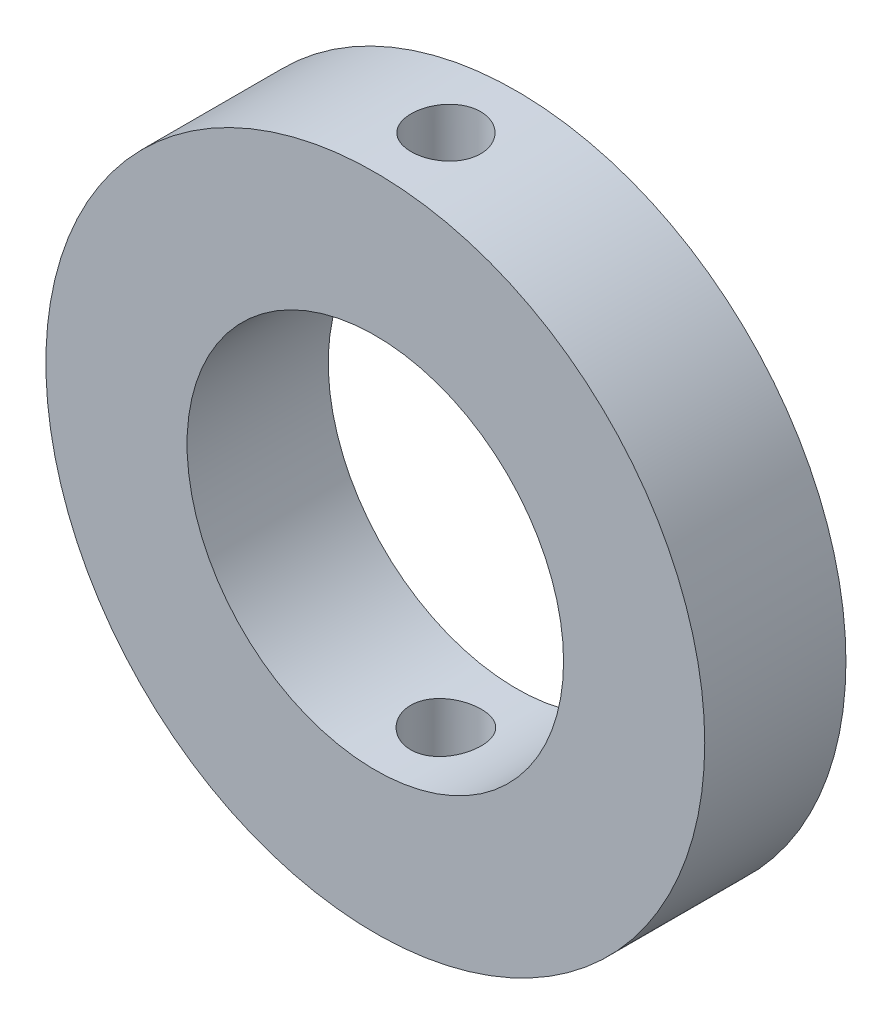
ISO-10303-21;
HEADER;
FILE_DESCRIPTION(('STEP AP214'),'2;1');
FILE_NAME('part.step','',(''),(''),'','','');
FILE_SCHEMA(('AUTOMOTIVE_DESIGN { 1 0 10303 214 1 1 1 1 }'));
ENDSEC;
DATA;
#1=APPLICATION_CONTEXT('core data for automotive mechanical design processes');
#2=APPLICATION_PROTOCOL_DEFINITION('international standard','automotive_design',2000,#1);
#3=PRODUCT_CONTEXT('',#1,'mechanical');
#4=PRODUCT('Part','Part','',(#3));
#5=PRODUCT_RELATED_PRODUCT_CATEGORY('part','',(#4));
#6=PRODUCT_DEFINITION_FORMATION('','',#4);
#7=PRODUCT_DEFINITION_CONTEXT('part definition',#1,'design');
#8=PRODUCT_DEFINITION('design','',#6,#7);
#9=PRODUCT_DEFINITION_SHAPE('','',#8);
#10=(LENGTH_UNIT() NAMED_UNIT(*) SI_UNIT(.MILLI.,.METRE.));
#11=(NAMED_UNIT(*) PLANE_ANGLE_UNIT() SI_UNIT($,.RADIAN.));
#12=(NAMED_UNIT(*) SI_UNIT($,.STERADIAN.) SOLID_ANGLE_UNIT());
#13=UNCERTAINTY_MEASURE_WITH_UNIT(LENGTH_MEASURE(1.E-05),#10,'distance_accuracy_value','');
#14=(GEOMETRIC_REPRESENTATION_CONTEXT(3) GLOBAL_UNCERTAINTY_ASSIGNED_CONTEXT((#13)) GLOBAL_UNIT_ASSIGNED_CONTEXT((#10,
#11,#12)) REPRESENTATION_CONTEXT('',''));
#15=CARTESIAN_POINT('',(0.,0.,0.));
#16=DIRECTION('',(0.,0.,1.));
#17=DIRECTION('',(1.,0.,0.));
#18=AXIS2_PLACEMENT_3D('',#15,#16,#17);
#19=CARTESIAN_POINT('',(0.,0.,4.7625));
#20=DIRECTION('',(0.,0.,-1.));
#21=DIRECTION('',(-1.,0.,0.));
#22=AXIS2_PLACEMENT_3D('',#19,#20,#21);
#23=CYLINDRICAL_SURFACE('',#22,11.1125);
#24=CARTESIAN_POINT('',(-0.841698326425389,11.0805776102734,1.5657979969277));
#25=CARTESIAN_POINT('',(-0.887456960862435,11.077101739902,1.61302840428348));
#26=CARTESIAN_POINT('',(-0.929261940955323,11.0736406475918,1.6641500561508));
#27=CARTESIAN_POINT('',(-1.0037461861398,11.0671385758728,1.77273865475646));
#28=CARTESIAN_POINT('',(-1.03641561509168,11.0640980510498,1.83021234851041));
#29=CARTESIAN_POINT('',(-1.09165020440123,11.058785144105,1.94985001516101));
#30=CARTESIAN_POINT('',(-1.11421771090546,11.0565125836555,2.01201289508271));
#31=CARTESIAN_POINT('',(-1.14859192084496,11.0529948186015,2.13925735469615));
#32=CARTESIAN_POINT('',(-1.16040132336789,11.051749356317,2.20433819800199));
#33=CARTESIAN_POINT('',(-1.17289918521659,11.050430032407,2.33533526115212));
#34=CARTESIAN_POINT('',(-1.17362736846984,11.0503519858497,2.40124764889747));
#35=CARTESIAN_POINT('',(-1.16404292357263,11.0513656536687,2.53225702649961));
#36=CARTESIAN_POINT('',(-1.15373002585106,11.0524573966059,2.59735399640847));
#37=CARTESIAN_POINT('',(-1.12239930934797,11.055682739142,2.7247447710209));
#38=CARTESIAN_POINT('',(-1.10140398219269,11.0578141493558,2.78704416724645));
#39=CARTESIAN_POINT('',(-1.04932600379547,11.0628771945404,2.90723822607505));
#40=CARTESIAN_POINT('',(-1.01824310482055,11.0658088491634,2.96513278045983));
#41=CARTESIAN_POINT('',(-0.946726950676453,11.0721566775975,3.07512751012811));
#42=CARTESIAN_POINT('',(-0.906256768914601,11.0755747437183,3.12720356611674));
#43=CARTESIAN_POINT('',(-0.817172201188247,11.0825031870893,3.22384258620289));
#44=CARTESIAN_POINT('',(-0.768557614954379,11.0860135666077,3.26840536549629));
#45=CARTESIAN_POINT('',(-0.664337517764288,11.0927473667703,3.34892696081736));
#46=CARTESIAN_POINT('',(-0.608705669421817,11.0959696238055,3.38485179774944));
#47=CARTESIAN_POINT('',(-0.49216621831279,11.1017488645506,3.44684742627995));
#48=CARTESIAN_POINT('',(-0.431258693337211,11.1043058580677,3.47291836314585));
#49=CARTESIAN_POINT('',(-0.306033994338718,11.108461293405,3.5144040529963));
#50=CARTESIAN_POINT('',(-0.24172464089294,11.1100618379876,3.52984219378192));
#51=CARTESIAN_POINT('',(-0.111409668123426,11.1121324992083,3.54970078348677));
#52=CARTESIAN_POINT('',(-0.0454041046493234,11.1126026530176,3.55412159469562));
#53=CARTESIAN_POINT('',(0.0860951748870768,11.1123600990054,3.55182109180445));
#54=CARTESIAN_POINT('',(0.151589832745728,11.1116530015016,3.5451526250296));
#55=CARTESIAN_POINT('',(0.280522850293855,11.1091458956894,3.52096996403273));
#56=CARTESIAN_POINT('',(0.343961207200995,11.1073458859023,3.50345575513622));
#57=CARTESIAN_POINT('',(0.466998873972595,11.1028537698324,3.45808740054108));
#58=CARTESIAN_POINT('',(0.526597739738218,11.1001615605729,3.4302320612355));
#59=CARTESIAN_POINT('',(0.640285749354609,11.0941847448392,3.36497616748501));
#60=CARTESIAN_POINT('',(0.694374715047201,11.0909001192193,3.32757530453027));
#61=CARTESIAN_POINT('',(0.795785263635065,11.0840868783762,3.24407698746112));
#62=CARTESIAN_POINT('',(0.84307310114645,11.0805571672219,3.19793863341919));
#63=CARTESIAN_POINT('',(0.929246111684692,11.0736638665026,3.09837641549377));
#64=CARTESIAN_POINT('',(0.96813116460663,11.0703002793126,3.04495244749139));
#65=CARTESIAN_POINT('',(1.03646820770654,11.0641119871222,2.9321982405629));
#66=CARTESIAN_POINT('',(1.06590082949595,11.0612883933145,2.87285619704791));
#67=CARTESIAN_POINT('',(1.11437335936579,11.0565105357714,2.75003652671121));
#68=CARTESIAN_POINT('',(1.13341356456308,11.054556247183,2.68655901817959));
#69=CARTESIAN_POINT('',(1.16048842612473,11.0517468956613,2.55754005969101));
#70=CARTESIAN_POINT('',(1.1685667582149,11.0508874712698,2.49200787122982));
#71=CARTESIAN_POINT('',(1.17362099415319,11.0503518953607,2.36051280041465));
#72=CARTESIAN_POINT('',(1.17059718069523,11.0506757137142,2.29454992906985));
#73=CARTESIAN_POINT('',(1.15357049867794,11.0524659094168,2.16433334282902));
#74=CARTESIAN_POINT('',(1.13961000267373,11.053927877039,2.10007401904406));
#75=CARTESIAN_POINT('',(1.1011688323638,11.057823189277,1.97481478942584));
#76=CARTESIAN_POINT('',(1.07668800123347,11.0602565483731,1.91381493219607));
#77=CARTESIAN_POINT('',(1.01784017695398,11.0658270792393,1.79664662568117));
#78=CARTESIAN_POINT('',(0.983450602601565,11.0689658549597,1.74048959695828));
#79=CARTESIAN_POINT('',(0.905779757471185,11.0755917981051,1.63472636625763));
#80=CARTESIAN_POINT('',(0.862498181763728,11.0790789774757,1.58512038902805));
#81=CARTESIAN_POINT('',(0.768020660274708,11.0860294884988,1.4936152484213));
#82=CARTESIAN_POINT('',(0.716787178653716,11.0894926211585,1.45175481489174));
#83=CARTESIAN_POINT('',(0.607997580829135,11.0959884496379,1.37722356570963));
#84=CARTESIAN_POINT('',(0.550441459450646,11.0990211451052,1.3445527575786));
#85=CARTESIAN_POINT('',(0.43063057132255,11.1043147004596,1.28933825323775));
#86=CARTESIAN_POINT('',(0.368376093391156,11.1065756077431,1.26679393512183));
#87=CARTESIAN_POINT('',(0.240938749902661,11.1100704132671,1.23248868977641));
#88=CARTESIAN_POINT('',(0.175756083785713,11.1113043813415,1.22072702930007));
#89=CARTESIAN_POINT('',(0.0446527392762468,11.1126026797177,1.20836255039739));
#90=CARTESIAN_POINT('',(-0.0212627568079269,11.1126727124683,1.20770532792226));
#91=CARTESIAN_POINT('',(-0.152279988979814,11.1116497274985,1.2174318106195));
#92=CARTESIAN_POINT('',(-0.217381553520133,11.1105564686439,1.2278178048977));
#93=CARTESIAN_POINT('',(-0.344797564320643,11.1073322617539,1.25929950087441));
#94=CARTESIAN_POINT('',(-0.40711625438565,11.1052029570765,1.28037824416492));
#95=CARTESIAN_POINT('',(-0.527284040473263,11.1001459728163,1.33261822706607));
#96=CARTESIAN_POINT('',(-0.585137722981045,11.0972191268659,1.36376894522221));
#97=CARTESIAN_POINT('',(-0.676548872191015,11.0919470744632,1.42334276915089));
#98=CARTESIAN_POINT('',(-0.71179225042346,11.0897317163237,1.44923335053269));
#99=CARTESIAN_POINT('',(-0.779171220760057,11.0852012695936,1.50477643518594));
#100=CARTESIAN_POINT('',(-0.811306796165637,11.0828861804672,1.53442895866874));
#101=CARTESIAN_POINT('',(-0.841698326425389,11.0805776102734,1.5657979969277));
#102=B_SPLINE_CURVE_WITH_KNOTS('',3,(#24,#25,#26,#27,#28,#29,#30,#31,#32,#33,#34,#35,#36,#37,
#38,#39,#40,#41,#42,#43,#44,#45,#46,#47,#48,#49,#50,#51,#52,#53,#54,#55,#56,#57,#58,#59,#60,#61,
#62,#63,#64,#65,#66,#67,#68,#69,#70,#71,#72,#73,#74,#75,#76,#77,#78,#79,#80,#81,#82,#83,#84,#85,
#86,#87,#88,#89,#90,#91,#92,#93,#94,#95,#96,#97,#98,#99,#100,#101),.UNSPECIFIED.,.T.,.F.,(4,2,2,
2,2,2,2,2,2,2,2,2,2,2,2,2,2,2,2,2,2,2,2,2,2,2,2,2,2,2,2,2,2,2,2,2,2,2,4),(0.,0.197401308403678,
0.39501434521769,0.592581463048866,0.790098999842977,0.986908308782151,1.18372242298558,
1.38012385357512,1.57653010780246,1.77372247245705,1.9709196867465,2.16888037036877,
2.36683813551527,2.56435907189634,2.76187351298902,2.9584493694745,3.15502549193143,
3.35162431090263,3.54822948472172,3.74577878796956,3.94333091469497,4.14128528809065,
4.33923400171875,4.53639168334324,4.73354434477661,4.92993692247875,5.12633242786902,
5.32317909101162,5.52003250565736,5.71784510512392,5.91565786649566,6.11345847777508,
6.31124563713592,6.50806349398541,6.70492215640452,6.90146957794564,7.09781234057103,
7.22891974092027,7.36002784568504),.UNSPECIFIED.);
#103=CARTESIAN_POINT('',(-0.841698326425389,11.0805776102734,1.5657979969277));
#104=VERTEX_POINT('',#103);
#105=EDGE_CURVE('E72',#104,#104,#102,.T.);
#106=ORIENTED_EDGE('',*,*,#105,.F.);
#107=EDGE_LOOP('',(#106));
#108=FACE_BOUND('',#107,.T.);
#109=CARTESIAN_POINT('',(0.,0.,4.7625));
#110=DIRECTION('',(0.,0.,1.));
#111=DIRECTION('',(1.,0.,0.));
#112=AXIS2_PLACEMENT_3D('',#109,#110,#111);
#113=CIRCLE('',#112,11.1125);
#114=CARTESIAN_POINT('',(11.1125,0.,4.7625));
#115=VERTEX_POINT('',#114);
#116=EDGE_CURVE('E10',#115,#115,#113,.T.);
#117=ORIENTED_EDGE('',*,*,#116,.F.);
#118=EDGE_LOOP('',(#117));
#119=FACE_BOUND('',#118,.T.);
#120=CARTESIAN_POINT('',(0.,0.,0.));
#121=DIRECTION('',(0.,0.,1.));
#122=DIRECTION('',(1.,0.,0.));
#123=AXIS2_PLACEMENT_3D('',#120,#121,#122);
#124=CIRCLE('',#123,11.1125);
#125=CARTESIAN_POINT('',(11.1125,0.,0.));
#126=VERTEX_POINT('',#125);
#127=EDGE_CURVE('E45',#126,#126,#124,.T.);
#128=ORIENTED_EDGE('',*,*,#127,.T.);
#129=EDGE_LOOP('',(#128));
#130=FACE_BOUND('',#129,.T.);
#131=CARTESIAN_POINT('',(-0.856986535747215,-11.0794056847625,1.55039458604627));
#132=CARTESIAN_POINT('',(-0.810348575017801,-11.0830128075068,1.50228867742869));
#133=CARTESIAN_POINT('',(-0.759621719416622,-11.0866392771216,1.45808757289963));
#134=CARTESIAN_POINT('',(-0.651415629052091,-11.0935229993324,1.37878006401395));
#135=CARTESIAN_POINT('',(-0.593929191523836,-11.0967798506829,1.34368349110681));
#136=CARTESIAN_POINT('',(-0.473857535539345,-11.1025547453848,1.28363325646928));
#137=CARTESIAN_POINT('',(-0.411273527584085,-11.1050729634869,1.25867719509046));
#138=CARTESIAN_POINT('',(-0.282788123772219,-11.1090870122136,1.21963285012448));
#139=CARTESIAN_POINT('',(-0.216887568692315,-11.1105831005702,1.2055418267822));
#140=CARTESIAN_POINT('',(-0.0838798350980418,-11.1123816889319,1.18866226310655));
#141=CARTESIAN_POINT('',(-0.0167778633549996,-11.1126884726953,1.18583315746159));
#142=CARTESIAN_POINT('',(0.11694844993892,-11.1120857860822,1.19144970307967));
#143=CARTESIAN_POINT('',(0.183572781796129,-11.1111762910914,1.19989558252017));
#144=CARTESIAN_POINT('',(0.314265793165964,-11.108247233622,1.22777536210551));
#145=CARTESIAN_POINT('',(0.378340879867034,-11.1062306712083,1.24717957010991));
#146=CARTESIAN_POINT('',(0.502325640094421,-11.1013142512173,1.29639256272892));
#147=CARTESIAN_POINT('',(0.56223522145322,-11.0984143741031,1.32620157747635));
#148=CARTESIAN_POINT('',(0.676430688067251,-11.0920414986724,1.39550413350126));
#149=CARTESIAN_POINT('',(0.730695174305656,-11.0885664403249,1.43503274232885));
#150=CARTESIAN_POINT('',(0.831839379569093,-11.0814383131852,1.52260586049815));
#151=CARTESIAN_POINT('',(0.878718888336266,-11.0777852393285,1.57065061222043));
#152=CARTESIAN_POINT('',(0.963972489347514,-11.0706935699951,1.67414492676581));
#153=CARTESIAN_POINT('',(1.00230836860023,-11.0672559856719,1.72962604787666));
#154=CARTESIAN_POINT('',(1.06911994990933,-11.0610021863148,1.84627020608387));
#155=CARTESIAN_POINT('',(1.09759576151836,-11.0581859643772,1.90743318004108));
#156=CARTESIAN_POINT('',(1.14382506336446,-11.0535000336456,2.03360534598973));
#157=CARTESIAN_POINT('',(1.16159629165404,-11.05162875986,2.09860797806328));
#158=CARTESIAN_POINT('',(1.18596761194506,-11.0490402057334,2.2306963743944));
#159=CARTESIAN_POINT('',(1.19256810450973,-11.0483228840138,2.29778206386929));
#160=CARTESIAN_POINT('',(1.19439844504829,-11.0481251493842,2.43176607659009));
#161=CARTESIAN_POINT('',(1.18968620836983,-11.0486384363735,2.49866360624729));
#162=CARTESIAN_POINT('',(1.16915090305975,-11.0508301656028,2.63071051471949));
#163=CARTESIAN_POINT('',(1.15332786113892,-11.0525086050417,2.69585989773673));
#164=CARTESIAN_POINT('',(1.11104346276961,-11.0568389093284,2.82253548565076));
#165=CARTESIAN_POINT('',(1.08458765294643,-11.0594902665873,2.88406356046187));
#166=CARTESIAN_POINT('',(1.0217945974496,-11.065468011785,3.00181621376326));
#167=CARTESIAN_POINT('',(0.985457028793302,-11.0687944217869,3.05804061882359));
#168=CARTESIAN_POINT('',(0.903721845654878,-11.0757676233341,3.1638850335955));
#169=CARTESIAN_POINT('',(0.858280871707543,-11.0794158995151,3.21347146521203));
#170=CARTESIAN_POINT('',(0.759724242328667,-11.08660955507,3.30432900551779));
#171=CARTESIAN_POINT('',(0.706608447517527,-11.0901549325739,3.34559996316016));
#172=CARTESIAN_POINT('',(0.594035807163904,-11.0967544853305,3.41875979182573));
#173=CARTESIAN_POINT('',(0.534562537817271,-11.0998073345868,3.45062352154462));
#174=CARTESIAN_POINT('',(0.411071715104856,-11.105066023778,3.50390242922207));
#175=CARTESIAN_POINT('',(0.347054281366322,-11.1072718860005,3.52531788211961));
#176=CARTESIAN_POINT('',(0.216544659086646,-11.1105808750342,3.55701376844221));
#177=CARTESIAN_POINT('',(0.150062576503518,-11.1116880786381,3.56733537974109));
#178=CARTESIAN_POINT('',(0.0163008560117727,-11.1126892626605,3.57668016743966));
#179=CARTESIAN_POINT('',(-0.0509787589075359,-11.1125832779653,3.57570366872626));
#180=CARTESIAN_POINT('',(-0.184118811873236,-11.1111732497157,3.5625108352637));
#181=CARTESIAN_POINT('',(-0.249984121259469,-11.1098743781675,3.55034302242414));
#182=CARTESIAN_POINT('',(-0.378731571201849,-11.106231076628,3.51519214856228));
#183=CARTESIAN_POINT('',(-0.44161367909185,-11.1038866351908,3.49220896914147));
#184=CARTESIAN_POINT('',(-0.562738069163244,-11.0984083495899,3.43603973159737));
#185=CARTESIAN_POINT('',(-0.620972043036266,-11.0952731317885,3.40283589707689));
#186=CARTESIAN_POINT('',(-0.731058138058821,-11.0885642141626,3.32717978339272));
#187=CARTESIAN_POINT('',(-0.782910027815567,-11.084990498449,3.28472716905404));
#188=CARTESIAN_POINT('',(-0.879039570931737,-11.0777834399499,3.19151981845567));
#189=CARTESIAN_POINT('',(-0.923277033892636,-11.0741498854116,3.14072363866071));
#190=CARTESIAN_POINT('',(-1.00260559327592,-11.0672502760475,3.03240787734224));
#191=CARTESIAN_POINT('',(-1.0376966371388,-11.0639842233335,2.97488825718551));
#192=CARTESIAN_POINT('',(-1.09774987757249,-11.0581877583864,2.85470286374593));
#193=CARTESIAN_POINT('',(-1.12270569064588,-11.0556578100593,2.7920338770036));
#194=CARTESIAN_POINT('',(-1.16172824552657,-11.0516257544387,2.66336385330359));
#195=CARTESIAN_POINT('',(-1.17579573633479,-11.0501235764463,2.59736304587257));
#196=CARTESIAN_POINT('',(-1.19258676998232,-11.048324090604,2.46425027283723));
#197=CARTESIAN_POINT('',(-1.19536606859449,-11.0480208609852,2.39714541645019));
#198=CARTESIAN_POINT('',(-1.18965026488293,-11.0486377572522,2.26340807130143));
#199=CARTESIAN_POINT('',(-1.18115288407234,-11.0495581303705,2.19677568073794));
#200=CARTESIAN_POINT('',(-1.1531670210815,-11.0525136184947,2.06605252443934));
#201=CARTESIAN_POINT('',(-1.13370354117508,-11.0545461974126,2.00195633080231));
#202=CARTESIAN_POINT('',(-1.08437613088348,-11.0594934066558,1.87799064577771));
#203=CARTESIAN_POINT('',(-1.05452302177883,-11.0624071188278,1.81811683431321));
#204=CARTESIAN_POINT('',(-0.996800613498211,-11.0677269408914,1.72315111941637));
#205=CARTESIAN_POINT('',(-0.971557650233806,-11.0699808591449,1.68642648271788));
#206=CARTESIAN_POINT('',(-0.917140009505489,-11.0746222340217,1.61602513061605));
#207=CARTESIAN_POINT('',(-0.887965311703059,-11.0770096913359,1.58234843098093));
#208=CARTESIAN_POINT('',(-0.856986535747215,-11.0794056847625,1.55039458604627));
#209=B_SPLINE_CURVE_WITH_KNOTS('',3,(#131,#132,#133,#134,#135,#136,#137,#138,#139,#140,#141,
#142,#143,#144,#145,#146,#147,#148,#149,#150,#151,#152,#153,#154,#155,#156,#157,#158,#159,#160,
#161,#162,#163,#164,#165,#166,#167,#168,#169,#170,#171,#172,#173,#174,#175,#176,#177,#178,#179,
#180,#181,#182,#183,#184,#185,#186,#187,#188,#189,#190,#191,#192,#193,#194,#195,#196,#197,#198,
#199,#200,#201,#202,#203,#204,#205,#206,#207,#208),.UNSPECIFIED.,.T.,.F.,(4,2,2,2,2,2,2,2,2,2,2,
2,2,2,2,2,2,2,2,2,2,2,2,2,2,2,2,2,2,2,2,2,2,2,2,2,2,2,4),(0.,0.201135904891147,
0.402488108948879,0.603792637277044,0.80504638753692,1.00557456434633,1.20610679940518,
1.40609827145454,1.60609416718221,1.80682250196865,2.00755655066355,2.20917116327964,
2.41078353573662,2.61206090029963,2.81333104725214,3.01357299388338,3.21381445912716,
3.41395160291978,3.61409528892782,3.81521594739274,4.0163402587951,4.21799731812786,
4.41964907071186,4.62054972418326,4.82144460059728,5.02147254711828,5.22150268344599,
5.42188270939358,5.62226999830452,5.82368453201036,6.02510022311067,6.22664257634859,
6.42817106438059,6.62870292312321,6.82927530609841,7.02939223178288,7.22930134712459,
7.36290306991965,7.49650548385129),.UNSPECIFIED.);
#210=CARTESIAN_POINT('',(-0.856986535747215,-11.0794056847625,1.55039458604627));
#211=VERTEX_POINT('',#210);
#212=EDGE_CURVE('E76',#211,#211,#209,.T.);
#213=ORIENTED_EDGE('',*,*,#212,.F.);
#214=EDGE_LOOP('',(#213));
#215=FACE_BOUND('',#214,.T.);
#216=ADVANCED_FACE('F33',(#108,#119,#130,#215),#23,.T.);
#217=CARTESIAN_POINT('',(0.,0.,0.));
#218=DIRECTION('',(0.,0.,1.));
#219=DIRECTION('',(1.,0.,0.));
#220=AXIS2_PLACEMENT_3D('',#217,#218,#219);
#221=CYLINDRICAL_SURFACE('',#220,6.35);
#222=CARTESIAN_POINT('',(0.,0.,0.));
#223=DIRECTION('',(0.,0.,1.));
#224=DIRECTION('',(1.,0.,0.));
#225=AXIS2_PLACEMENT_3D('',#222,#223,#224);
#226=CIRCLE('',#225,6.35);
#227=CARTESIAN_POINT('',(6.35,0.,0.));
#228=VERTEX_POINT('',#227);
#229=EDGE_CURVE('E50',#228,#228,#226,.T.);
#230=ORIENTED_EDGE('',*,*,#229,.F.);
#231=EDGE_LOOP('',(#230));
#232=FACE_BOUND('',#231,.T.);
#233=CARTESIAN_POINT('',(0.,0.,4.7625));
#234=DIRECTION('',(0.,0.,1.));
#235=DIRECTION('',(1.,0.,0.));
#236=AXIS2_PLACEMENT_3D('',#233,#234,#235);
#237=CIRCLE('',#236,6.35);
#238=CARTESIAN_POINT('',(6.35,0.,4.7625));
#239=VERTEX_POINT('',#238);
#240=EDGE_CURVE('E53',#239,#239,#237,.T.);
#241=ORIENTED_EDGE('',*,*,#240,.T.);
#242=EDGE_LOOP('',(#241));
#243=FACE_BOUND('',#242,.T.);
#244=CARTESIAN_POINT('',(-0.857111717692388,6.29188838929893,1.57515465369985));
#245=CARTESIAN_POINT('',(-0.81188640158319,6.29804872551004,1.52707909958887));
#246=CARTESIAN_POINT('',(-0.762588767342832,6.30426616281409,1.48279593951107));
#247=CARTESIAN_POINT('',(-0.657192740955467,6.31612291490715,1.40306542481245));
#248=CARTESIAN_POINT('',(-0.601088719611336,6.32176174394843,1.36762545898744));
#249=CARTESIAN_POINT('',(-0.483621571692924,6.331830772882,1.30662104504583));
#250=CARTESIAN_POINT('',(-0.422257328818659,6.33626071539137,1.28105869948315));
#251=CARTESIAN_POINT('',(-0.296025406281717,6.34341080696731,1.24060466789254));
#252=CARTESIAN_POINT('',(-0.231158653519997,6.34613140600803,1.22571017347384));
#253=CARTESIAN_POINT('',(-0.100485209806926,6.34953765269471,1.20715079428265));
#254=CARTESIAN_POINT('',(-0.0346956831266626,6.35024449032262,1.20336896215231));
#255=CARTESIAN_POINT('',(0.0965829588048631,6.34960472000764,1.20682240947088));
#256=CARTESIAN_POINT('',(0.162072079657721,6.34825815051153,1.2140574826457));
#257=CARTESIAN_POINT('',(0.290312063668903,6.34368215966461,1.2392064420312));
#258=CARTESIAN_POINT('',(0.353081507181932,6.34046888298875,1.25702879105269));
#259=CARTESIAN_POINT('',(0.474737274398333,6.33252271591556,1.30273977982124));
#260=CARTESIAN_POINT('',(0.533623369872068,6.32778973629901,1.33062901059015));
#261=CARTESIAN_POINT('',(0.646484218451241,6.31726251603799,1.39599650217644));
#262=CARTESIAN_POINT('',(0.700404856968684,6.31145827725762,1.43356654566588));
#263=CARTESIAN_POINT('',(0.801233071345324,6.29945301156308,1.51711687929646));
#264=CARTESIAN_POINT('',(0.848139999183564,6.29325194806039,1.56309794568949));
#265=CARTESIAN_POINT('',(0.934256757425072,6.28104971291086,1.66290374981499));
#266=CARTESIAN_POINT('',(0.973354789754594,6.27505234286228,1.71682550936886));
#267=CARTESIAN_POINT('',(1.04194275632497,6.26402959340131,1.83056026098607));
#268=CARTESIAN_POINT('',(1.07143294707036,6.25900418804144,1.89037309571739));
#269=CARTESIAN_POINT('',(1.11983467480491,6.25052602648631,2.01398399303245));
#270=CARTESIAN_POINT('',(1.13878565276131,6.24706741600308,2.0777661903669));
#271=CARTESIAN_POINT('',(1.1656835143307,6.24210476910655,2.20768175767792));
#272=CARTESIAN_POINT('',(1.1736316501863,6.24060051026807,2.27381485921728));
#273=CARTESIAN_POINT('',(1.17823359719761,6.2397332141291,2.40544780944999));
#274=CARTESIAN_POINT('',(1.17506206623572,6.24033706388454,2.47094139077489));
#275=CARTESIAN_POINT('',(1.15791244881281,6.24354173731863,2.60044549688717));
#276=CARTESIAN_POINT('',(1.14393450909475,6.24614253388022,2.66445604180092));
#277=CARTESIAN_POINT('',(1.105662266182,6.25303001365637,2.78900350618057));
#278=CARTESIAN_POINT('',(1.08139881764533,6.2573116518342,2.84955020497318));
#279=CARTESIAN_POINT('',(1.02326993024506,6.26707932996284,2.9657384517281));
#280=CARTESIAN_POINT('',(0.989403624458904,6.27256547864382,3.02137955623049));
#281=CARTESIAN_POINT('',(0.912458961713889,6.28422228249689,3.12703701958388));
#282=CARTESIAN_POINT('',(0.869255637194266,6.2904016145236,3.17696142594988));
#283=CARTESIAN_POINT('',(0.775115172854628,6.30269350304185,3.26890499646205));
#284=CARTESIAN_POINT('',(0.724177525599253,6.30880605512384,3.31092364151977));
#285=CARTESIAN_POINT('',(0.615426549315494,6.32034518683663,3.38625281970556));
#286=CARTESIAN_POINT('',(0.557552745087937,6.32576473153695,3.41947723026912));
#287=CARTESIAN_POINT('',(0.43693441542089,6.33523820225184,3.47571126515526));
#288=CARTESIAN_POINT('',(0.374190232524813,6.33929222419944,3.49872160709018));
#289=CARTESIAN_POINT('',(0.246247609556157,6.34554349856134,3.53364896251121));
#290=CARTESIAN_POINT('',(0.181078653139557,6.34775827049766,3.54567075939276));
#291=CARTESIAN_POINT('',(0.049613099521918,6.3501463328508,3.55861834181958));
#292=CARTESIAN_POINT('',(-0.0166833957023594,6.35031980691356,3.5595451255309));
#293=CARTESIAN_POINT('',(-0.147581003141956,6.3486178622821,3.55033811690973));
#294=CARTESIAN_POINT('',(-0.212192931730331,6.34676980473606,3.54035203050558));
#295=CARTESIAN_POINT('',(-0.338803904889768,6.34127190730653,3.50986360206313));
#296=CARTESIAN_POINT('',(-0.400802893612192,6.33762202893233,3.48936103537019));
#297=CARTESIAN_POINT('',(-0.520682996014448,6.32890329656073,3.43836488558426));
#298=CARTESIAN_POINT('',(-0.57854946325466,6.32382968206326,3.40783772426321));
#299=CARTESIAN_POINT('',(-0.688382561752303,6.31281873617002,3.33768028065564));
#300=CARTESIAN_POINT('',(-0.740348603195388,6.30688131856245,3.29804908951325));
#301=CARTESIAN_POINT('',(-0.837732402880272,6.2946924324169,3.21010267539372));
#302=CARTESIAN_POINT('',(-0.883040050164357,6.28843758577931,3.16166592933219));
#303=CARTESIAN_POINT('',(-0.964915059952091,6.27639675110603,3.05784128472704));
#304=CARTESIAN_POINT('',(-1.0014821492331,6.27061077773066,3.00245316897185));
#305=CARTESIAN_POINT('',(-1.06495522512609,6.26014485105266,2.88601388160285));
#306=CARTESIAN_POINT('',(-1.09182374944054,6.25546920987215,2.82494187308813));
#307=CARTESIAN_POINT('',(-1.1348842484279,6.24780122239096,2.69904569845727));
#308=CARTESIAN_POINT('',(-1.15107761105202,6.24480865726943,2.634222021314));
#309=CARTESIAN_POINT('',(-1.17212859437659,6.24089167993785,2.5036265913217));
#310=CARTESIAN_POINT('',(-1.17714097456723,6.23993903998981,2.43788062256678));
#311=CARTESIAN_POINT('',(-1.17612681246507,6.24013029991553,2.3064679045582));
#312=CARTESIAN_POINT('',(-1.17009916322938,6.24127441002266,2.24080116390906));
#313=CARTESIAN_POINT('',(-1.14731075631014,6.24550304975415,2.11208991519878));
#314=CARTESIAN_POINT('',(-1.13065463963307,6.24856865640455,2.04902615469949));
#315=CARTESIAN_POINT('',(-1.08721840197284,6.25627197436475,1.92662966119347));
#316=CARTESIAN_POINT('',(-1.06044567835824,6.26090853671995,1.86729423887148));
#317=CARTESIAN_POINT('',(-1.00536770053025,6.26995258196838,1.76798154612376));
#318=CARTESIAN_POINT('',(-0.979081719732861,6.27413274703735,1.72684778193589));
#319=CARTESIAN_POINT('',(-0.921640333226066,6.28282770046616,1.64817246153975));
#320=CARTESIAN_POINT('',(-0.890484794185487,6.28734249798664,1.61063100373618));
#321=CARTESIAN_POINT('',(-0.857111717692388,6.29188838929893,1.57515465369985));
#322=B_SPLINE_CURVE_WITH_KNOTS('',3,(#244,#245,#246,#247,#248,#249,#250,#251,#252,#253,#254,
#255,#256,#257,#258,#259,#260,#261,#262,#263,#264,#265,#266,#267,#268,#269,#270,#271,#272,#273,
#274,#275,#276,#277,#278,#279,#280,#281,#282,#283,#284,#285,#286,#287,#288,#289,#290,#291,#292,
#293,#294,#295,#296,#297,#298,#299,#300,#301,#302,#303,#304,#305,#306,#307,#308,#309,#310,#311,
#312,#313,#314,#315,#316,#317,#318,#319,#320,#321),.UNSPECIFIED.,.T.,.F.,(4,2,2,2,2,2,2,2,2,2,2,
2,2,2,2,2,2,2,2,2,2,2,2,2,2,2,2,2,2,2,2,2,2,2,2,2,2,2,4),(0.,0.198699195966035,
0.397563860241178,0.596470831634956,0.795325420029944,0.992079673675459,1.18883024345508,
1.38390397918331,1.5789891694613,1.77599673893735,1.9730224993907,2.17269356112206,
2.37235929171514,2.57127269539959,2.77016345872236,2.96594431173868,3.16172250624422,
3.35691751205671,3.55213014521249,3.75013812128679,3.94815909393519,4.14805300136905,
4.34793286258335,4.5458862188105,4.74382176597288,4.93911106381531,5.13440453363106,
5.33035894419801,5.52633292541367,5.72525121358731,5.92417571896966,6.12386058190267,
6.32351947730983,6.52039721887018,6.71729470171348,6.91228295562733,7.10712890713191,
7.25375080928171,7.40037672672318),.UNSPECIFIED.);
#323=CARTESIAN_POINT('',(-0.857111717692388,6.29188838929893,1.57515465369985));
#324=VERTEX_POINT('',#323);
#325=EDGE_CURVE('E55',#324,#324,#322,.T.);
#326=ORIENTED_EDGE('',*,*,#325,.F.);
#327=EDGE_LOOP('',(#326));
#328=FACE_BOUND('',#327,.T.);
#329=CARTESIAN_POINT('',(-0.86572364134808,-6.29070922685284,1.56632820750968));
#330=CARTESIAN_POINT('',(-0.911332734227284,-6.28443264154799,1.61479265691998));
#331=CARTESIAN_POINT('',(-0.952890613304666,-6.27820741846199,1.66712104667908));
#332=CARTESIAN_POINT('',(-1.02672304189355,-6.26655761733717,1.77808669047218));
#333=CARTESIAN_POINT('',(-1.05899030380148,-6.26113366943729,1.8367288477873));
#334=CARTESIAN_POINT('',(-1.11328540977593,-6.25170846281038,1.95871443490885));
#335=CARTESIAN_POINT('',(-1.13531007552042,-6.24770764577745,2.02205931692966));
#336=CARTESIAN_POINT('',(-1.16841796342869,-6.24160126726916,2.15162151633086));
#337=CARTESIAN_POINT('',(-1.17950402669529,-6.23949521367604,2.21783808317638));
#338=CARTESIAN_POINT('',(-1.19032656916466,-6.2374396239067,2.35045375358264));
#339=CARTESIAN_POINT('',(-1.19019271863841,-6.23746544922468,2.41684190589746));
#340=CARTESIAN_POINT('',(-1.17890259458268,-6.23960902407156,2.54863916576052));
#341=CARTESIAN_POINT('',(-1.1677463034864,-6.24172677693443,2.61404827174826));
#342=CARTESIAN_POINT('',(-1.13485904705008,-6.24778917240071,2.74164696855008));
#343=CARTESIAN_POINT('',(-1.11319038926954,-6.25172304416833,2.80385316971616));
#344=CARTESIAN_POINT('',(-1.05994896925725,-6.26096912546826,2.92376086567395));
#345=CARTESIAN_POINT('',(-1.02837541219923,-6.26628144560929,2.98146199848873));
#346=CARTESIAN_POINT('',(-0.955735677661935,-6.27777305416242,3.09154543462769));
#347=CARTESIAN_POINT('',(-0.914550570543581,-6.28396278776224,3.14384816341157));
#348=CARTESIAN_POINT('',(-0.824052220101749,-6.29646885576378,3.24085883492805));
#349=CARTESIAN_POINT('',(-0.774738336949772,-6.30278520009681,3.28556617925327));
#350=CARTESIAN_POINT('',(-0.668687612106282,-6.31492147708902,3.36664038511917));
#351=CARTESIAN_POINT('',(-0.611870917031062,-6.32073476221092,3.40290390916409));
#352=CARTESIAN_POINT('',(-0.492842765740827,-6.3311270644489,3.46535854661443));
#353=CARTESIAN_POINT('',(-0.430631603714466,-6.33570614881655,3.49155020886861));
#354=CARTESIAN_POINT('',(-0.3030689945714,-6.34308258344721,3.53290402053896));
#355=CARTESIAN_POINT('',(-0.237745158905339,-6.34589327403871,3.54814887657752));
#356=CARTESIAN_POINT('',(-0.105412409447349,-6.34946977252593,3.56744978332849));
#357=CARTESIAN_POINT('',(-0.0384036683196359,-6.35023578909878,3.57150697584262));
#358=CARTESIAN_POINT('',(0.0943391344135152,-6.34964106663841,3.56832842814894));
#359=CARTESIAN_POINT('',(0.160077387079787,-6.34831162570635,3.56125888106038));
#360=CARTESIAN_POINT('',(0.28941156781142,-6.34373153840809,3.53635881166408));
#361=CARTESIAN_POINT('',(0.353007484085942,-6.34048088146987,3.51852823014073));
#362=CARTESIAN_POINT('',(0.476330170399739,-6.33241141120423,3.47263164385943));
#363=CARTESIAN_POINT('',(0.536054252017147,-6.32759152196779,3.44455861499897));
#364=CARTESIAN_POINT('',(0.649980870489574,-6.3169061228606,3.37898826360485));
#365=CARTESIAN_POINT('',(0.70418287184923,-6.31104051173395,3.34149002829625));
#366=CARTESIAN_POINT('',(0.806401966799969,-6.29880223778508,3.25746486866011));
#367=CARTESIAN_POINT('',(0.854313256509975,-6.29242325365777,3.2108101074238));
#368=CARTESIAN_POINT('',(0.941671266305948,-6.27994484452904,3.11011770726651));
#369=CARTESIAN_POINT('',(0.981117550418934,-6.2738454339392,3.05607968832027));
#370=CARTESIAN_POINT('',(1.05067662443891,-6.26257401314502,2.94169472917274));
#371=CARTESIAN_POINT('',(1.08072423087101,-6.25740858021588,2.88130744818569));
#372=CARTESIAN_POINT('',(1.13021761120607,-6.24865939408512,2.75622689289844));
#373=CARTESIAN_POINT('',(1.14966438672371,-6.24507549145942,2.69153402605791));
#374=CARTESIAN_POINT('',(1.17717480482871,-6.23994831126031,2.56052802575854));
#375=CARTESIAN_POINT('',(1.18537604979888,-6.23838038096352,2.49424476580284));
#376=CARTESIAN_POINT('',(1.19057936136086,-6.23738957114838,2.36122688793618));
#377=CARTESIAN_POINT('',(1.18758232410324,-6.23796651998453,2.29449230656916));
#378=CARTESIAN_POINT('',(1.17059374821171,-6.2411763064645,2.16332784783553));
#379=CARTESIAN_POINT('',(1.15673757749676,-6.2437838288403,2.09887973798144));
#380=CARTESIAN_POINT('',(1.11862284945758,-6.25072436213549,1.9732362919939));
#381=CARTESIAN_POINT('',(1.09436379242958,-6.25505745594217,1.91204111227403));
#382=CARTESIAN_POINT('',(1.0359423964587,-6.26499827581334,1.79413988754127));
#383=CARTESIAN_POINT('',(1.00171005899337,-6.27061494857326,1.73746930994812));
#384=CARTESIAN_POINT('',(0.92437043476717,-6.28248084222966,1.63061975804633));
#385=CARTESIAN_POINT('',(0.881262248413251,-6.28873012721057,1.58044144258738));
#386=CARTESIAN_POINT('',(0.786605262807721,-6.30127457252791,1.48719609620518));
#387=CARTESIAN_POINT('',(0.734936909136426,-6.30756896153469,1.44425022692373));
#388=CARTESIAN_POINT('',(0.625053598477063,-6.31940319414995,1.3676248080232));
#389=CARTESIAN_POINT('',(0.566838636485646,-6.32494303718175,1.33394526548612));
#390=CARTESIAN_POINT('',(0.445479979830445,-6.33464664892771,1.27684033719644));
#391=CARTESIAN_POINT('',(0.382337133775296,-6.33881065392518,1.25341319049615));
#392=CARTESIAN_POINT('',(0.252919418035371,-6.3452915655992,1.21753120400062));
#393=CARTESIAN_POINT('',(0.186644965791037,-6.34760871772803,1.20507490612358));
#394=CARTESIAN_POINT('',(0.053922654456586,-6.3501126622533,1.19163354612569));
#395=CARTESIAN_POINT('',(-0.0125072908171398,-6.35033126872358,1.19047717165435));
#396=CARTESIAN_POINT('',(-0.144617673110164,-6.34869671556482,1.19922717076686));
#397=CARTESIAN_POINT('',(-0.210298020647936,-6.3468433111541,1.20913485142766));
#398=CARTESIAN_POINT('',(-0.338606304774096,-6.3412891027071,1.23960177697628));
#399=CARTESIAN_POINT('',(-0.401250979712365,-6.33760010771237,1.26009296580402));
#400=CARTESIAN_POINT('',(-0.522183643854774,-6.32878329483744,1.31106863790981));
#401=CARTESIAN_POINT('',(-0.580474656177015,-6.32365648733922,1.34154610613586));
#402=CARTESIAN_POINT('',(-0.677935657016432,-6.3138501729585,1.40323082798146));
#403=CARTESIAN_POINT('',(-0.718348786805376,-6.30935595389971,1.43252776752093));
#404=CARTESIAN_POINT('',(-0.795172563042198,-6.30013464346808,1.49593743143007));
#405=CARTESIAN_POINT('',(-0.831583095303582,-6.2954075454572,1.53005029312546));
#406=CARTESIAN_POINT('',(-0.86572364134808,-6.29070922685284,1.56632820750968));
#407=B_SPLINE_CURVE_WITH_KNOTS('',3,(#329,#330,#331,#332,#333,#334,#335,#336,#337,#338,#339,
#340,#341,#342,#343,#344,#345,#346,#347,#348,#349,#350,#351,#352,#353,#354,#355,#356,#357,#358,
#359,#360,#361,#362,#363,#364,#365,#366,#367,#368,#369,#370,#371,#372,#373,#374,#375,#376,#377,
#378,#379,#380,#381,#382,#383,#384,#385,#386,#387,#388,#389,#390,#391,#392,#393,#394,#395,#396,
#397,#398,#399,#400,#401,#402,#403,#404,#405,#406),.UNSPECIFIED.,.T.,.F.,(4,2,2,2,2,2,2,2,2,2,2,
2,2,2,2,2,2,2,2,2,2,2,2,2,2,2,2,2,2,2,2,2,2,2,2,2,2,2,4),(0.,0.20036003253387,0.400876802899788,
0.601455753040854,0.801982592727704,1.00019223602828,1.19840219522225,1.39545144268354,
1.59251650656016,1.79216300109901,1.99182521763174,2.19381569249586,2.39579515867666,
2.59623207291411,2.7966485300037,2.99409978495089,3.1915521264388,3.38914013281165,
3.58674728178019,3.78733964203871,3.9879423309226,4.18990691721224,4.39185241766073,
4.59130413637819,4.79073989417082,4.98772831980598,5.1847262088616,5.38314150293627,
5.5815769168847,5.78306244890516,5.98454813491517,6.18599920022315,6.38742348761458,
6.58578925866726,6.78417846658431,6.98130755098481,7.17829845412866,7.32827306219347,
7.47825194763889),.UNSPECIFIED.);
#408=CARTESIAN_POINT('',(-0.86572364134808,-6.29070922685284,1.56632820750968));
#409=VERTEX_POINT('',#408);
#410=EDGE_CURVE('E37',#409,#409,#407,.T.);
#411=ORIENTED_EDGE('',*,*,#410,.F.);
#412=EDGE_LOOP('',(#411));
#413=FACE_BOUND('',#412,.T.);
#414=ADVANCED_FACE('F59',(#232,#243,#328,#413),#221,.F.);
#415=CARTESIAN_POINT('',(0.,0.,4.7625));
#416=DIRECTION('',(0.,0.,1.));
#417=DIRECTION('',(1.,0.,0.));
#418=AXIS2_PLACEMENT_3D('',#415,#416,#417);
#419=PLANE('',#418);
#420=ORIENTED_EDGE('',*,*,#240,.F.);
#421=EDGE_LOOP('',(#420));
#422=FACE_BOUND('',#421,.T.);
#423=ORIENTED_EDGE('',*,*,#116,.T.);
#424=EDGE_LOOP('',(#423));
#425=FACE_BOUND('',#424,.T.);
#426=ADVANCED_FACE('F88',(#422,#425),#419,.T.);
#427=CARTESIAN_POINT('',(0.,0.,0.));
#428=DIRECTION('',(0.,0.,1.));
#429=DIRECTION('',(1.,0.,0.));
#430=AXIS2_PLACEMENT_3D('',#427,#428,#429);
#431=PLANE('',#430);
#432=ORIENTED_EDGE('',*,*,#229,.T.);
#433=EDGE_LOOP('',(#432));
#434=FACE_BOUND('',#433,.T.);
#435=ORIENTED_EDGE('',*,*,#127,.F.);
#436=EDGE_LOOP('',(#435));
#437=FACE_BOUND('',#436,.T.);
#438=ADVANCED_FACE('F90',(#434,#437),#431,.F.);
#439=CARTESIAN_POINT('',(0.,-11.1125,2.38125));
#440=DIRECTION('',(0.,-1.,0.));
#441=DIRECTION('',(1.,0.,0.));
#442=AXIS2_PLACEMENT_3D('',#439,#440,#441);
#443=CONICAL_SURFACE('',#442,1.19365991850283,0.000979166353735445);
#444=ORIENTED_EDGE('',*,*,#325,.T.);
#445=EDGE_LOOP('',(#444));
#446=FACE_BOUND('',#445,.T.);
#447=ORIENTED_EDGE('',*,*,#105,.T.);
#448=EDGE_LOOP('',(#447));
#449=FACE_BOUND('',#448,.T.);
#450=ADVANCED_FACE('F65',(#446,#449),#443,.F.);
#451=ORIENTED_EDGE('',*,*,#410,.T.);
#452=EDGE_LOOP('',(#451));
#453=FACE_BOUND('',#452,.T.);
#454=ORIENTED_EDGE('',*,*,#212,.T.);
#455=EDGE_LOOP('',(#454));
#456=FACE_BOUND('',#455,.T.);
#457=ADVANCED_FACE('F62',(#453,#456),#443,.F.);
#458=CLOSED_SHELL('',(#216,#414,#426,#438,#450,#457));
#459=MANIFOLD_SOLID_BREP('B2',#458);
#460=ADVANCED_BREP_SHAPE_REPRESENTATION('',(#18,#459),#14);
#461=SHAPE_DEFINITION_REPRESENTATION(#9,#460);
ENDSEC;
END-ISO-10303-21;
